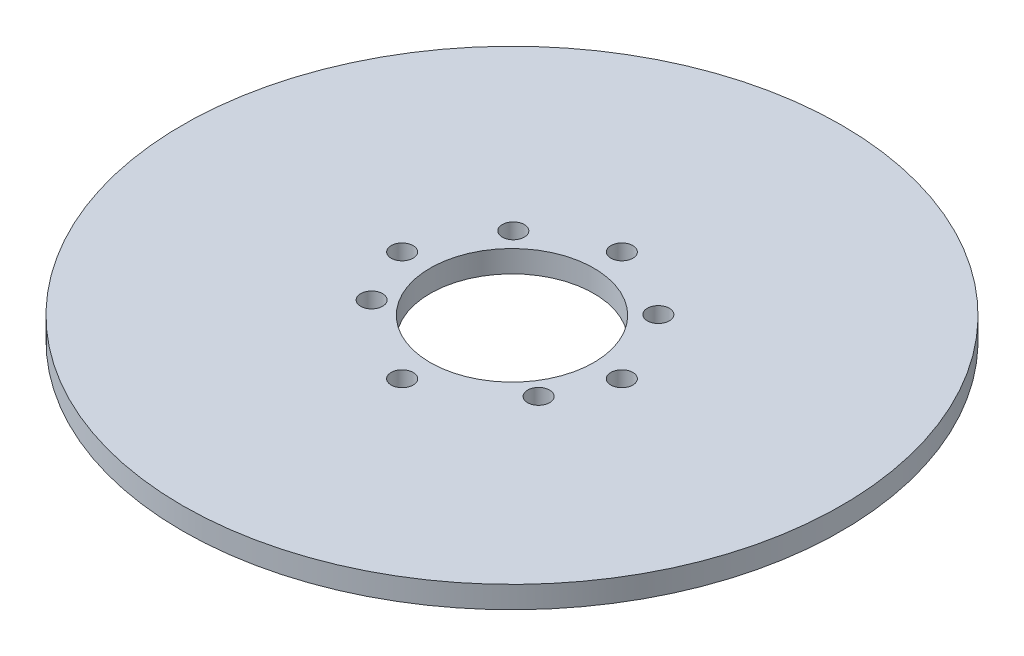
ISO-10303-21;
HEADER;
FILE_DESCRIPTION(('STEP AP214'),'2;1');
FILE_NAME('part.step','',(''),(''),'','','');
FILE_SCHEMA(('AUTOMOTIVE_DESIGN { 1 0 10303 214 1 1 1 1 }'));
ENDSEC;
DATA;
#1=APPLICATION_CONTEXT('core data for automotive mechanical design processes');
#2=APPLICATION_PROTOCOL_DEFINITION('international standard','automotive_design',2000,#1);
#3=PRODUCT_CONTEXT('',#1,'mechanical');
#4=PRODUCT('Part','Part','',(#3));
#5=PRODUCT_RELATED_PRODUCT_CATEGORY('part','',(#4));
#6=PRODUCT_DEFINITION_FORMATION('','',#4);
#7=PRODUCT_DEFINITION_CONTEXT('part definition',#1,'design');
#8=PRODUCT_DEFINITION('design','',#6,#7);
#9=PRODUCT_DEFINITION_SHAPE('','',#8);
#10=(LENGTH_UNIT() NAMED_UNIT(*) SI_UNIT(.MILLI.,.METRE.));
#11=(NAMED_UNIT(*) PLANE_ANGLE_UNIT() SI_UNIT($,.RADIAN.));
#12=(NAMED_UNIT(*) SI_UNIT($,.STERADIAN.) SOLID_ANGLE_UNIT());
#13=UNCERTAINTY_MEASURE_WITH_UNIT(LENGTH_MEASURE(1.E-05),#10,'distance_accuracy_value','');
#14=(GEOMETRIC_REPRESENTATION_CONTEXT(3) GLOBAL_UNCERTAINTY_ASSIGNED_CONTEXT((#13)) GLOBAL_UNIT_ASSIGNED_CONTEXT((#10,
#11,#12)) REPRESENTATION_CONTEXT('',''));
#15=CARTESIAN_POINT('',(0.,0.,0.));
#16=DIRECTION('',(0.,0.,1.));
#17=DIRECTION('',(1.,0.,0.));
#18=AXIS2_PLACEMENT_3D('',#15,#16,#17);
#19=CARTESIAN_POINT('',(-49.9999999999979,10.,3.00000000000159));
#20=DIRECTION('',(0.,-1.,0.));
#21=DIRECTION('',(0.,0.,-1.));
#22=AXIS2_PLACEMENT_3D('',#19,#20,#21);
#23=CYLINDRICAL_SURFACE('',#22,5.);
#24=CARTESIAN_POINT('',(-49.9999999999979,10.,3.00000000000159));
#25=DIRECTION('',(0.,1.,0.));
#26=DIRECTION('',(0.,0.,1.));
#27=AXIS2_PLACEMENT_3D('',#24,#25,#26);
#28=CIRCLE('',#27,5.);
#29=CARTESIAN_POINT('',(-49.9999999999979,10.,8.00000000000159));
#30=VERTEX_POINT('',#29);
#31=EDGE_CURVE('E41',#30,#30,#28,.T.);
#32=ORIENTED_EDGE('',*,*,#31,.T.);
#33=EDGE_LOOP('',(#32));
#34=FACE_BOUND('',#33,.T.);
#35=CARTESIAN_POINT('',(-49.9999999999979,0.,3.00000000000159));
#36=DIRECTION('',(0.,1.,0.));
#37=DIRECTION('',(0.,0.,1.));
#38=AXIS2_PLACEMENT_3D('',#35,#36,#37);
#39=CIRCLE('',#38,5.);
#40=CARTESIAN_POINT('',(-49.9999999999979,0.,8.00000000000159));
#41=VERTEX_POINT('',#40);
#42=EDGE_CURVE('E73',#41,#41,#39,.T.);
#43=ORIENTED_EDGE('',*,*,#42,.F.);
#44=EDGE_LOOP('',(#43));
#45=FACE_BOUND('',#44,.T.);
#46=ADVANCED_FACE('F33',(#34,#45),#23,.F.);
#47=CARTESIAN_POINT('',(3.89573857868908E-12,10.,53.));
#48=DIRECTION('',(0.,-1.,0.));
#49=DIRECTION('',(0.,0.,-1.));
#50=AXIS2_PLACEMENT_3D('',#47,#48,#49);
#51=CYLINDRICAL_SURFACE('',#50,5.);
#52=CARTESIAN_POINT('',(3.89573857868908E-12,10.,53.));
#53=DIRECTION('',(0.,1.,0.));
#54=DIRECTION('',(0.,0.,1.));
#55=AXIS2_PLACEMENT_3D('',#52,#53,#54);
#56=CIRCLE('',#55,5.);
#57=CARTESIAN_POINT('',(3.89573857868908E-12,10.,58.));
#58=VERTEX_POINT('',#57);
#59=EDGE_CURVE('E46',#58,#58,#56,.T.);
#60=ORIENTED_EDGE('',*,*,#59,.T.);
#61=EDGE_LOOP('',(#60));
#62=FACE_BOUND('',#61,.T.);
#63=CARTESIAN_POINT('',(3.89573857868908E-12,0.,53.));
#64=DIRECTION('',(0.,1.,0.));
#65=DIRECTION('',(0.,0.,1.));
#66=AXIS2_PLACEMENT_3D('',#63,#64,#65);
#67=CIRCLE('',#66,5.);
#68=CARTESIAN_POINT('',(3.89573857868908E-12,0.,58.));
#69=VERTEX_POINT('',#68);
#70=EDGE_CURVE('E71',#69,#69,#67,.T.);
#71=ORIENTED_EDGE('',*,*,#70,.F.);
#72=EDGE_LOOP('',(#71));
#73=FACE_BOUND('',#72,.T.);
#74=ADVANCED_FACE('F106',(#62,#73),#51,.F.);
#75=CARTESIAN_POINT('',(50.0000000000021,10.,2.99999999999806));
#76=DIRECTION('',(0.,-1.,0.));
#77=DIRECTION('',(0.,0.,-1.));
#78=AXIS2_PLACEMENT_3D('',#75,#76,#77);
#79=CYLINDRICAL_SURFACE('',#78,5.);
#80=CARTESIAN_POINT('',(50.0000000000021,10.,2.99999999999806));
#81=DIRECTION('',(0.,1.,0.));
#82=DIRECTION('',(0.,0.,1.));
#83=AXIS2_PLACEMENT_3D('',#80,#81,#82);
#84=CIRCLE('',#83,5.);
#85=CARTESIAN_POINT('',(50.0000000000021,10.,7.99999999999805));
#86=VERTEX_POINT('',#85);
#87=EDGE_CURVE('E101',#86,#86,#84,.T.);
#88=ORIENTED_EDGE('',*,*,#87,.T.);
#89=EDGE_LOOP('',(#88));
#90=FACE_BOUND('',#89,.T.);
#91=CARTESIAN_POINT('',(50.0000000000021,0.,2.99999999999806));
#92=DIRECTION('',(0.,1.,0.));
#93=DIRECTION('',(0.,0.,1.));
#94=AXIS2_PLACEMENT_3D('',#91,#92,#93);
#95=CIRCLE('',#94,5.);
#96=CARTESIAN_POINT('',(50.0000000000021,0.,7.99999999999805));
#97=VERTEX_POINT('',#96);
#98=EDGE_CURVE('E68',#97,#97,#95,.T.);
#99=ORIENTED_EDGE('',*,*,#98,.F.);
#100=EDGE_LOOP('',(#99));
#101=FACE_BOUND('',#100,.T.);
#102=ADVANCED_FACE('F124',(#90,#101),#79,.F.);
#103=CARTESIAN_POINT('',(0.,10.,-47.));
#104=DIRECTION('',(0.,-1.,0.));
#105=DIRECTION('',(0.,0.,-1.));
#106=AXIS2_PLACEMENT_3D('',#103,#104,#105);
#107=CYLINDRICAL_SURFACE('',#106,5.);
#108=CARTESIAN_POINT('',(0.,10.,-47.));
#109=DIRECTION('',(0.,1.,0.));
#110=DIRECTION('',(0.,0.,1.));
#111=AXIS2_PLACEMENT_3D('',#108,#109,#110);
#112=CIRCLE('',#111,5.);
#113=CARTESIAN_POINT('',(0.,10.,-42.));
#114=VERTEX_POINT('',#113);
#115=EDGE_CURVE('E98',#114,#114,#112,.T.);
#116=ORIENTED_EDGE('',*,*,#115,.T.);
#117=EDGE_LOOP('',(#116));
#118=FACE_BOUND('',#117,.T.);
#119=CARTESIAN_POINT('',(0.,0.,-47.));
#120=DIRECTION('',(0.,1.,0.));
#121=DIRECTION('',(0.,0.,1.));
#122=AXIS2_PLACEMENT_3D('',#119,#120,#121);
#123=CIRCLE('',#122,5.);
#124=CARTESIAN_POINT('',(0.,0.,-42.));
#125=VERTEX_POINT('',#124);
#126=EDGE_CURVE('E65',#125,#125,#123,.T.);
#127=ORIENTED_EDGE('',*,*,#126,.F.);
#128=EDGE_LOOP('',(#127));
#129=FACE_BOUND('',#128,.T.);
#130=ADVANCED_FACE('F131',(#118,#129),#107,.F.);
#131=CARTESIAN_POINT('',(0.,10.,3.));
#132=DIRECTION('',(0.,-1.,0.));
#133=DIRECTION('',(0.,0.,-1.));
#134=AXIS2_PLACEMENT_3D('',#131,#132,#133);
#135=CYLINDRICAL_SURFACE('',#134,37.25);
#136=CARTESIAN_POINT('',(0.,10.,3.));
#137=DIRECTION('',(0.,1.,0.));
#138=DIRECTION('',(0.,0.,1.));
#139=AXIS2_PLACEMENT_3D('',#136,#137,#138);
#140=CIRCLE('',#139,37.25);
#141=CARTESIAN_POINT('',(0.,10.,40.25));
#142=VERTEX_POINT('',#141);
#143=EDGE_CURVE('E95',#142,#142,#140,.T.);
#144=ORIENTED_EDGE('',*,*,#143,.T.);
#145=EDGE_LOOP('',(#144));
#146=FACE_BOUND('',#145,.T.);
#147=CARTESIAN_POINT('',(0.,0.,3.));
#148=DIRECTION('',(0.,1.,0.));
#149=DIRECTION('',(0.,0.,1.));
#150=AXIS2_PLACEMENT_3D('',#147,#148,#149);
#151=CIRCLE('',#150,37.25);
#152=CARTESIAN_POINT('',(0.,0.,40.25));
#153=VERTEX_POINT('',#152);
#154=EDGE_CURVE('E62',#153,#153,#151,.T.);
#155=ORIENTED_EDGE('',*,*,#154,.F.);
#156=EDGE_LOOP('',(#155));
#157=FACE_BOUND('',#156,.T.);
#158=ADVANCED_FACE('F135',(#146,#157),#135,.F.);
#159=CARTESIAN_POINT('',(-38.,10.,28.8961342206525));
#160=DIRECTION('',(0.,-1.,0.));
#161=DIRECTION('',(0.,0.,-1.));
#162=AXIS2_PLACEMENT_3D('',#159,#160,#161);
#163=CYLINDRICAL_SURFACE('',#162,5.);
#164=CARTESIAN_POINT('',(-38.,10.,28.8961342206525));
#165=DIRECTION('',(0.,1.,0.));
#166=DIRECTION('',(0.,0.,1.));
#167=AXIS2_PLACEMENT_3D('',#164,#165,#166);
#168=CIRCLE('',#167,5.);
#169=CARTESIAN_POINT('',(-38.,10.,33.8961342206525));
#170=VERTEX_POINT('',#169);
#171=EDGE_CURVE('E92',#170,#170,#168,.T.);
#172=ORIENTED_EDGE('',*,*,#171,.T.);
#173=EDGE_LOOP('',(#172));
#174=FACE_BOUND('',#173,.T.);
#175=CARTESIAN_POINT('',(-38.,0.,28.8961342206525));
#176=DIRECTION('',(0.,1.,0.));
#177=DIRECTION('',(0.,0.,1.));
#178=AXIS2_PLACEMENT_3D('',#175,#176,#177);
#179=CIRCLE('',#178,5.);
#180=CARTESIAN_POINT('',(-38.,0.,33.8961342206525));
#181=VERTEX_POINT('',#180);
#182=EDGE_CURVE('E59',#181,#181,#179,.T.);
#183=ORIENTED_EDGE('',*,*,#182,.F.);
#184=EDGE_LOOP('',(#183));
#185=FACE_BOUND('',#184,.T.);
#186=ADVANCED_FACE('F139',(#174,#185),#163,.F.);
#187=CARTESIAN_POINT('',(38.,10.,28.8961342206525));
#188=DIRECTION('',(0.,-1.,0.));
#189=DIRECTION('',(0.,0.,-1.));
#190=AXIS2_PLACEMENT_3D('',#187,#188,#189);
#191=CYLINDRICAL_SURFACE('',#190,4.99999999999999);
#192=CARTESIAN_POINT('',(38.,10.,28.8961342206525));
#193=DIRECTION('',(0.,1.,0.));
#194=DIRECTION('',(0.,0.,1.));
#195=AXIS2_PLACEMENT_3D('',#192,#193,#194);
#196=CIRCLE('',#195,4.99999999999999);
#197=CARTESIAN_POINT('',(38.,10.,33.8961342206525));
#198=VERTEX_POINT('',#197);
#199=EDGE_CURVE('E87',#198,#198,#196,.T.);
#200=ORIENTED_EDGE('',*,*,#199,.T.);
#201=EDGE_LOOP('',(#200));
#202=FACE_BOUND('',#201,.T.);
#203=CARTESIAN_POINT('',(38.,0.,28.8961342206525));
#204=DIRECTION('',(0.,1.,0.));
#205=DIRECTION('',(0.,0.,1.));
#206=AXIS2_PLACEMENT_3D('',#203,#204,#205);
#207=CIRCLE('',#206,4.99999999999999);
#208=CARTESIAN_POINT('',(38.,0.,33.8961342206525));
#209=VERTEX_POINT('',#208);
#210=EDGE_CURVE('E56',#209,#209,#207,.T.);
#211=ORIENTED_EDGE('',*,*,#210,.F.);
#212=EDGE_LOOP('',(#211));
#213=FACE_BOUND('',#212,.T.);
#214=ADVANCED_FACE('F143',(#202,#213),#191,.F.);
#215=CARTESIAN_POINT('',(33.,10.,-30.5941170815567));
#216=DIRECTION('',(0.,-1.,0.));
#217=DIRECTION('',(0.,0.,-1.));
#218=AXIS2_PLACEMENT_3D('',#215,#216,#217);
#219=CYLINDRICAL_SURFACE('',#218,5.00000000000001);
#220=CARTESIAN_POINT('',(33.,10.,-30.5941170815567));
#221=DIRECTION('',(0.,1.,0.));
#222=DIRECTION('',(0.,0.,1.));
#223=AXIS2_PLACEMENT_3D('',#220,#221,#222);
#224=CIRCLE('',#223,5.00000000000001);
#225=CARTESIAN_POINT('',(33.,10.,-25.5941170815567));
#226=VERTEX_POINT('',#225);
#227=EDGE_CURVE('E82',#226,#226,#224,.T.);
#228=ORIENTED_EDGE('',*,*,#227,.T.);
#229=EDGE_LOOP('',(#228));
#230=FACE_BOUND('',#229,.T.);
#231=CARTESIAN_POINT('',(33.,0.,-30.5941170815567));
#232=DIRECTION('',(0.,1.,0.));
#233=DIRECTION('',(0.,0.,1.));
#234=AXIS2_PLACEMENT_3D('',#231,#232,#233);
#235=CIRCLE('',#234,5.00000000000001);
#236=CARTESIAN_POINT('',(33.,0.,-25.5941170815567));
#237=VERTEX_POINT('',#236);
#238=EDGE_CURVE('E53',#237,#237,#235,.T.);
#239=ORIENTED_EDGE('',*,*,#238,.F.);
#240=EDGE_LOOP('',(#239));
#241=FACE_BOUND('',#240,.T.);
#242=ADVANCED_FACE('F146',(#230,#241),#219,.F.);
#243=CARTESIAN_POINT('',(-33.,10.,-30.5941170815567));
#244=DIRECTION('',(0.,-1.,0.));
#245=DIRECTION('',(0.,0.,-1.));
#246=AXIS2_PLACEMENT_3D('',#243,#244,#245);
#247=CYLINDRICAL_SURFACE('',#246,5.);
#248=CARTESIAN_POINT('',(-33.,10.,-30.5941170815567));
#249=DIRECTION('',(0.,1.,0.));
#250=DIRECTION('',(0.,0.,1.));
#251=AXIS2_PLACEMENT_3D('',#248,#249,#250);
#252=CIRCLE('',#251,5.);
#253=CARTESIAN_POINT('',(-33.,10.,-25.5941170815567));
#254=VERTEX_POINT('',#253);
#255=EDGE_CURVE('E78',#254,#254,#252,.T.);
#256=ORIENTED_EDGE('',*,*,#255,.T.);
#257=EDGE_LOOP('',(#256));
#258=FACE_BOUND('',#257,.T.);
#259=CARTESIAN_POINT('',(-33.,0.,-30.5941170815567));
#260=DIRECTION('',(0.,1.,0.));
#261=DIRECTION('',(0.,0.,1.));
#262=AXIS2_PLACEMENT_3D('',#259,#260,#261);
#263=CIRCLE('',#262,5.);
#264=CARTESIAN_POINT('',(-33.,0.,-25.5941170815567));
#265=VERTEX_POINT('',#264);
#266=EDGE_CURVE('E50',#265,#265,#263,.T.);
#267=ORIENTED_EDGE('',*,*,#266,.F.);
#268=EDGE_LOOP('',(#267));
#269=FACE_BOUND('',#268,.T.);
#270=ADVANCED_FACE('F35',(#258,#269),#247,.F.);
#271=CARTESIAN_POINT('',(0.,10.,3.));
#272=DIRECTION('',(0.,-1.,0.));
#273=DIRECTION('',(0.,0.,-1.));
#274=AXIS2_PLACEMENT_3D('',#271,#272,#273);
#275=CYLINDRICAL_SURFACE('',#274,150.);
#276=CARTESIAN_POINT('',(0.,10.,3.));
#277=DIRECTION('',(0.,1.,0.));
#278=DIRECTION('',(0.,0.,1.));
#279=AXIS2_PLACEMENT_3D('',#276,#277,#278);
#280=CIRCLE('',#279,150.);
#281=CARTESIAN_POINT('',(0.,10.,153.));
#282=VERTEX_POINT('',#281);
#283=EDGE_CURVE('E10',#282,#282,#280,.T.);
#284=ORIENTED_EDGE('',*,*,#283,.F.);
#285=EDGE_LOOP('',(#284));
#286=FACE_BOUND('',#285,.T.);
#287=CARTESIAN_POINT('',(0.,0.,3.));
#288=DIRECTION('',(0.,1.,0.));
#289=DIRECTION('',(0.,0.,1.));
#290=AXIS2_PLACEMENT_3D('',#287,#288,#289);
#291=CIRCLE('',#290,150.);
#292=CARTESIAN_POINT('',(0.,0.,153.));
#293=VERTEX_POINT('',#292);
#294=EDGE_CURVE('E37',#293,#293,#291,.T.);
#295=ORIENTED_EDGE('',*,*,#294,.T.);
#296=EDGE_LOOP('',(#295));
#297=FACE_BOUND('',#296,.T.);
#298=ADVANCED_FACE('F113',(#286,#297),#275,.T.);
#299=CARTESIAN_POINT('',(0.,10.,0.));
#300=DIRECTION('',(0.,1.,0.));
#301=DIRECTION('',(0.,0.,1.));
#302=AXIS2_PLACEMENT_3D('',#299,#300,#301);
#303=PLANE('',#302);
#304=ORIENTED_EDGE('',*,*,#255,.F.);
#305=EDGE_LOOP('',(#304));
#306=FACE_BOUND('',#305,.T.);
#307=ORIENTED_EDGE('',*,*,#227,.F.);
#308=EDGE_LOOP('',(#307));
#309=FACE_BOUND('',#308,.T.);
#310=ORIENTED_EDGE('',*,*,#199,.F.);
#311=EDGE_LOOP('',(#310));
#312=FACE_BOUND('',#311,.T.);
#313=ORIENTED_EDGE('',*,*,#171,.F.);
#314=EDGE_LOOP('',(#313));
#315=FACE_BOUND('',#314,.T.);
#316=ORIENTED_EDGE('',*,*,#143,.F.);
#317=EDGE_LOOP('',(#316));
#318=FACE_BOUND('',#317,.T.);
#319=ORIENTED_EDGE('',*,*,#115,.F.);
#320=EDGE_LOOP('',(#319));
#321=FACE_BOUND('',#320,.T.);
#322=ORIENTED_EDGE('',*,*,#87,.F.);
#323=EDGE_LOOP('',(#322));
#324=FACE_BOUND('',#323,.T.);
#325=ORIENTED_EDGE('',*,*,#59,.F.);
#326=EDGE_LOOP('',(#325));
#327=FACE_BOUND('',#326,.T.);
#328=ORIENTED_EDGE('',*,*,#31,.F.);
#329=EDGE_LOOP('',(#328));
#330=FACE_BOUND('',#329,.T.);
#331=ORIENTED_EDGE('',*,*,#283,.T.);
#332=EDGE_LOOP('',(#331));
#333=FACE_BOUND('',#332,.T.);
#334=ADVANCED_FACE('F109',(#306,#309,#312,#315,#318,#321,#324,#327,#330,#333),#303,.T.);
#335=CARTESIAN_POINT('',(0.,0.,0.));
#336=DIRECTION('',(0.,1.,0.));
#337=DIRECTION('',(0.,0.,1.));
#338=AXIS2_PLACEMENT_3D('',#335,#336,#337);
#339=PLANE('',#338);
#340=ORIENTED_EDGE('',*,*,#266,.T.);
#341=EDGE_LOOP('',(#340));
#342=FACE_BOUND('',#341,.T.);
#343=ORIENTED_EDGE('',*,*,#238,.T.);
#344=EDGE_LOOP('',(#343));
#345=FACE_BOUND('',#344,.T.);
#346=ORIENTED_EDGE('',*,*,#210,.T.);
#347=EDGE_LOOP('',(#346));
#348=FACE_BOUND('',#347,.T.);
#349=ORIENTED_EDGE('',*,*,#182,.T.);
#350=EDGE_LOOP('',(#349));
#351=FACE_BOUND('',#350,.T.);
#352=ORIENTED_EDGE('',*,*,#154,.T.);
#353=EDGE_LOOP('',(#352));
#354=FACE_BOUND('',#353,.T.);
#355=ORIENTED_EDGE('',*,*,#126,.T.);
#356=EDGE_LOOP('',(#355));
#357=FACE_BOUND('',#356,.T.);
#358=ORIENTED_EDGE('',*,*,#98,.T.);
#359=EDGE_LOOP('',(#358));
#360=FACE_BOUND('',#359,.T.);
#361=ORIENTED_EDGE('',*,*,#70,.T.);
#362=EDGE_LOOP('',(#361));
#363=FACE_BOUND('',#362,.T.);
#364=ORIENTED_EDGE('',*,*,#42,.T.);
#365=EDGE_LOOP('',(#364));
#366=FACE_BOUND('',#365,.T.);
#367=ORIENTED_EDGE('',*,*,#294,.F.);
#368=EDGE_LOOP('',(#367));
#369=FACE_BOUND('',#368,.T.);
#370=ADVANCED_FACE('F112',(#342,#345,#348,#351,#354,#357,#360,#363,#366,#369),#339,.F.);
#371=CLOSED_SHELL('',(#46,#74,#102,#130,#158,#186,#214,#242,#270,#298,#334,#370));
#372=MANIFOLD_SOLID_BREP('B2',#371);
#373=ADVANCED_BREP_SHAPE_REPRESENTATION('',(#18,#372),#14);
#374=SHAPE_DEFINITION_REPRESENTATION(#9,#373);
ENDSEC;
END-ISO-10303-21;
